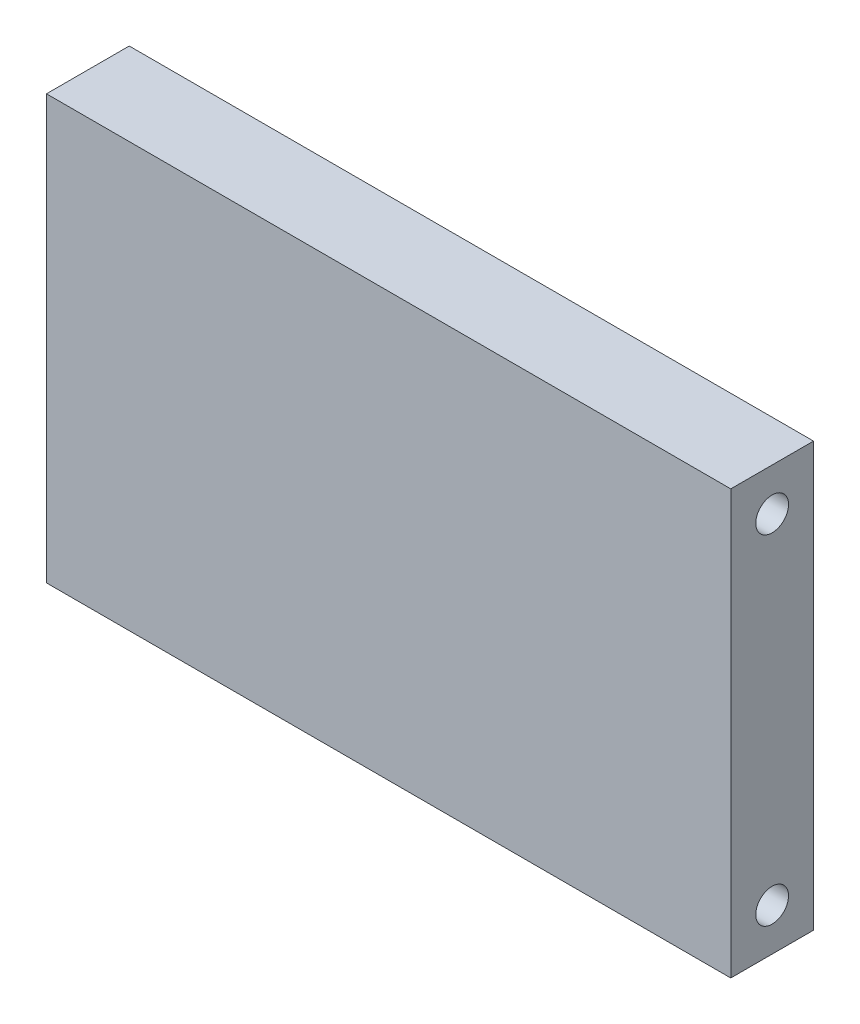
ISO-10303-21;
HEADER;
FILE_DESCRIPTION(('STEP AP214'),'2;1');
FILE_NAME('part.step','',(''),(''),'','','');
FILE_SCHEMA(('AUTOMOTIVE_DESIGN { 1 0 10303 214 1 1 1 1 }'));
ENDSEC;
DATA;
#1=APPLICATION_CONTEXT('core data for automotive mechanical design processes');
#2=APPLICATION_PROTOCOL_DEFINITION('international standard','automotive_design',2000,#1);
#3=PRODUCT_CONTEXT('',#1,'mechanical');
#4=PRODUCT('Part','Part','',(#3));
#5=PRODUCT_RELATED_PRODUCT_CATEGORY('part','',(#4));
#6=PRODUCT_DEFINITION_FORMATION('','',#4);
#7=PRODUCT_DEFINITION_CONTEXT('part definition',#1,'design');
#8=PRODUCT_DEFINITION('design','',#6,#7);
#9=PRODUCT_DEFINITION_SHAPE('','',#8);
#10=(LENGTH_UNIT() NAMED_UNIT(*) SI_UNIT(.MILLI.,.METRE.));
#11=(NAMED_UNIT(*) PLANE_ANGLE_UNIT() SI_UNIT($,.RADIAN.));
#12=(NAMED_UNIT(*) SI_UNIT($,.STERADIAN.) SOLID_ANGLE_UNIT());
#13=UNCERTAINTY_MEASURE_WITH_UNIT(LENGTH_MEASURE(1.E-05),#10,'distance_accuracy_value','');
#14=(GEOMETRIC_REPRESENTATION_CONTEXT(3) GLOBAL_UNCERTAINTY_ASSIGNED_CONTEXT((#13)) GLOBAL_UNIT_ASSIGNED_CONTEXT((#10,
#11,#12)) REPRESENTATION_CONTEXT('',''));
#15=CARTESIAN_POINT('',(0.,0.,0.));
#16=DIRECTION('',(0.,0.,1.));
#17=DIRECTION('',(1.,0.,0.));
#18=AXIS2_PLACEMENT_3D('',#15,#16,#17);
#19=CARTESIAN_POINT('',(-90.2093865777307,-9.44435697292469,0.));
#20=DIRECTION('',(0.,0.,1.));
#21=DIRECTION('',(1.,0.,0.));
#22=AXIS2_PLACEMENT_3D('',#19,#20,#21);
#23=PLANE('',#22);
#24=DIRECTION('',(0.,1.,0.));
#25=VECTOR('',#24,1.);
#26=CARTESIAN_POINT('',(-37.7093865777307,-41.9443569729247,0.));
#27=LINE('',#26,#25);
#28=CARTESIAN_POINT('',(-37.7093865777307,-41.9443569729247,0.));
#29=VERTEX_POINT('',#28);
#30=CARTESIAN_POINT('',(-37.7093865777307,23.0556430270753,0.));
#31=VERTEX_POINT('',#30);
#32=EDGE_CURVE('E27',#29,#31,#27,.T.);
#33=ORIENTED_EDGE('',*,*,#32,.F.);
#34=DIRECTION('',(1.,0.,0.));
#35=VECTOR('',#34,1.);
#36=CARTESIAN_POINT('',(-142.709386577731,-41.9443569729247,0.));
#37=LINE('',#36,#35);
#38=CARTESIAN_POINT('',(-142.709386577731,-41.9443569729247,0.));
#39=VERTEX_POINT('',#38);
#40=EDGE_CURVE('E137',#39,#29,#37,.T.);
#41=ORIENTED_EDGE('',*,*,#40,.F.);
#42=DIRECTION('',(0.,-1.,0.));
#43=VECTOR('',#42,1.);
#44=CARTESIAN_POINT('',(-142.709386577731,23.0556430270753,0.));
#45=LINE('',#44,#43);
#46=CARTESIAN_POINT('',(-142.709386577731,23.0556430270753,0.));
#47=VERTEX_POINT('',#46);
#48=EDGE_CURVE('E147',#47,#39,#45,.T.);
#49=ORIENTED_EDGE('',*,*,#48,.F.);
#50=DIRECTION('',(-1.,0.,0.));
#51=VECTOR('',#50,1.);
#52=CARTESIAN_POINT('',(-37.7093865777307,23.0556430270753,0.));
#53=LINE('',#52,#51);
#54=EDGE_CURVE('E142',#31,#47,#53,.T.);
#55=ORIENTED_EDGE('',*,*,#54,.F.);
#56=EDGE_LOOP('',(#33,#41,#49,#55));
#57=FACE_BOUND('',#56,.T.);
#58=ADVANCED_FACE('F16',(#57),#23,.F.);
#59=CARTESIAN_POINT('',(-90.2093865777307,-9.44435697292469,12.7));
#60=DIRECTION('',(0.,0.,1.));
#61=DIRECTION('',(1.,0.,0.));
#62=AXIS2_PLACEMENT_3D('',#59,#60,#61);
#63=PLANE('',#62);
#64=DIRECTION('',(0.,1.,0.));
#65=VECTOR('',#64,1.);
#66=CARTESIAN_POINT('',(-37.7093865777307,-41.9443569729247,12.7));
#67=LINE('',#66,#65);
#68=CARTESIAN_POINT('',(-37.7093865777307,-41.9443569729247,12.7));
#69=VERTEX_POINT('',#68);
#70=CARTESIAN_POINT('',(-37.7093865777307,23.0556430270753,12.7));
#71=VERTEX_POINT('',#70);
#72=EDGE_CURVE('E11',#69,#71,#67,.T.);
#73=ORIENTED_EDGE('',*,*,#72,.T.);
#74=DIRECTION('',(-1.,0.,0.));
#75=VECTOR('',#74,1.);
#76=CARTESIAN_POINT('',(-37.7093865777307,23.0556430270753,12.7));
#77=LINE('',#76,#75);
#78=CARTESIAN_POINT('',(-142.709386577731,23.0556430270753,12.7));
#79=VERTEX_POINT('',#78);
#80=EDGE_CURVE('E139',#71,#79,#77,.T.);
#81=ORIENTED_EDGE('',*,*,#80,.T.);
#82=DIRECTION('',(0.,-1.,0.));
#83=VECTOR('',#82,1.);
#84=CARTESIAN_POINT('',(-142.709386577731,23.0556430270753,12.7));
#85=LINE('',#84,#83);
#86=CARTESIAN_POINT('',(-142.709386577731,-41.9443569729247,12.7));
#87=VERTEX_POINT('',#86);
#88=EDGE_CURVE('E172',#79,#87,#85,.T.);
#89=ORIENTED_EDGE('',*,*,#88,.T.);
#90=DIRECTION('',(1.,0.,0.));
#91=VECTOR('',#90,1.);
#92=CARTESIAN_POINT('',(-142.709386577731,-41.9443569729247,12.7));
#93=LINE('',#92,#91);
#94=EDGE_CURVE('E148',#87,#69,#93,.T.);
#95=ORIENTED_EDGE('',*,*,#94,.T.);
#96=EDGE_LOOP('',(#73,#81,#89,#95));
#97=FACE_BOUND('',#96,.T.);
#98=ADVANCED_FACE('F183',(#97),#63,.T.);
#99=CARTESIAN_POINT('',(-37.7093865777307,-41.9443569729247,0.));
#100=DIRECTION('',(1.,0.,0.));
#101=DIRECTION('',(0.,1.,0.));
#102=AXIS2_PLACEMENT_3D('',#99,#100,#101);
#103=PLANE('',#102);
#104=CARTESIAN_POINT('',(-37.7093865777307,16.5556430270753,6.35));
#105=DIRECTION('',(-1.,0.,0.));
#106=DIRECTION('',(0.,1.,0.));
#107=AXIS2_PLACEMENT_3D('',#104,#105,#106);
#108=CIRCLE('',#107,2.51435);
#109=CARTESIAN_POINT('',(-37.7093865777307,14.0412930270753,6.35));
#110=VERTEX_POINT('',#109);
#111=EDGE_CURVE('E109',#110,#110,#108,.T.);
#112=ORIENTED_EDGE('',*,*,#111,.T.);
#113=EDGE_LOOP('',(#112));
#114=FACE_BOUND('',#113,.T.);
#115=CARTESIAN_POINT('',(-37.7093865777307,-35.4443569729247,6.35));
#116=DIRECTION('',(-1.,0.,0.));
#117=DIRECTION('',(0.,1.,0.));
#118=AXIS2_PLACEMENT_3D('',#115,#116,#117);
#119=CIRCLE('',#118,2.51435);
#120=CARTESIAN_POINT('',(-37.7093865777307,-37.9587069729247,6.35));
#121=VERTEX_POINT('',#120);
#122=EDGE_CURVE('E122',#121,#121,#119,.T.);
#123=ORIENTED_EDGE('',*,*,#122,.T.);
#124=EDGE_LOOP('',(#123));
#125=FACE_BOUND('',#124,.T.);
#126=ORIENTED_EDGE('',*,*,#32,.T.);
#127=DIRECTION('',(0.,0.,1.));
#128=VECTOR('',#127,1.);
#129=CARTESIAN_POINT('',(-37.7093865777307,23.0556430270753,0.));
#130=LINE('',#129,#128);
#131=EDGE_CURVE('E141',#31,#71,#130,.T.);
#132=ORIENTED_EDGE('',*,*,#131,.T.);
#133=ORIENTED_EDGE('',*,*,#72,.F.);
#134=DIRECTION('',(0.,0.,1.));
#135=VECTOR('',#134,1.);
#136=CARTESIAN_POINT('',(-37.7093865777307,-41.9443569729247,0.));
#137=LINE('',#136,#135);
#138=EDGE_CURVE('E120',#29,#69,#137,.T.);
#139=ORIENTED_EDGE('',*,*,#138,.F.);
#140=EDGE_LOOP('',(#126,#132,#133,#139));
#141=FACE_BOUND('',#140,.T.);
#142=ADVANCED_FACE('F155',(#114,#125,#141),#103,.T.);
#143=CARTESIAN_POINT('',(-37.7093865777307,23.0556430270753,0.));
#144=DIRECTION('',(0.,1.,0.));
#145=DIRECTION('',(1.,0.,0.));
#146=AXIS2_PLACEMENT_3D('',#143,#144,#145);
#147=PLANE('',#146);
#148=ORIENTED_EDGE('',*,*,#54,.T.);
#149=DIRECTION('',(0.,0.,1.));
#150=VECTOR('',#149,1.);
#151=CARTESIAN_POINT('',(-142.709386577731,23.0556430270753,0.));
#152=LINE('',#151,#150);
#153=EDGE_CURVE('E168',#47,#79,#152,.T.);
#154=ORIENTED_EDGE('',*,*,#153,.T.);
#155=ORIENTED_EDGE('',*,*,#80,.F.);
#156=ORIENTED_EDGE('',*,*,#131,.F.);
#157=EDGE_LOOP('',(#148,#154,#155,#156));
#158=FACE_BOUND('',#157,.T.);
#159=ADVANCED_FACE('F163',(#158),#147,.T.);
#160=CARTESIAN_POINT('',(-142.709386577731,23.0556430270753,0.));
#161=DIRECTION('',(-1.,0.,0.));
#162=DIRECTION('',(0.,0.,1.));
#163=AXIS2_PLACEMENT_3D('',#160,#161,#162);
#164=PLANE('',#163);
#165=ORIENTED_EDGE('',*,*,#48,.T.);
#166=DIRECTION('',(0.,0.,1.));
#167=VECTOR('',#166,1.);
#168=CARTESIAN_POINT('',(-142.709386577731,-41.9443569729247,0.));
#169=LINE('',#168,#167);
#170=EDGE_CURVE('E143',#39,#87,#169,.T.);
#171=ORIENTED_EDGE('',*,*,#170,.T.);
#172=ORIENTED_EDGE('',*,*,#88,.F.);
#173=ORIENTED_EDGE('',*,*,#153,.F.);
#174=EDGE_LOOP('',(#165,#171,#172,#173));
#175=FACE_BOUND('',#174,.T.);
#176=ADVANCED_FACE('F187',(#175),#164,.T.);
#177=CARTESIAN_POINT('',(-142.709386577731,-41.9443569729247,0.));
#178=DIRECTION('',(0.,-1.,0.));
#179=DIRECTION('',(0.,0.,-1.));
#180=AXIS2_PLACEMENT_3D('',#177,#178,#179);
#181=PLANE('',#180);
#182=ORIENTED_EDGE('',*,*,#40,.T.);
#183=ORIENTED_EDGE('',*,*,#138,.T.);
#184=ORIENTED_EDGE('',*,*,#94,.F.);
#185=ORIENTED_EDGE('',*,*,#170,.F.);
#186=EDGE_LOOP('',(#182,#183,#184,#185));
#187=FACE_BOUND('',#186,.T.);
#188=ADVANCED_FACE('F18',(#187),#181,.T.);
#189=CARTESIAN_POINT('',(-40.3833865777307,16.5556430270753,6.35));
#190=DIRECTION('',(-1.,0.,0.));
#191=DIRECTION('',(0.,1.,0.));
#192=AXIS2_PLACEMENT_3D('',#189,#190,#191);
#193=CYLINDRICAL_SURFACE('',#192,2.51435);
#194=ORIENTED_EDGE('',*,*,#111,.F.);
#195=DIRECTION('',(-1.,0.,0.));
#196=VECTOR('',#195,1.);
#197=CARTESIAN_POINT('',(-40.3833865777307,14.0412930270753,6.35));
#198=LINE('',#197,#196);
#199=CARTESIAN_POINT('',(-47.8833865777306,14.0412930270753,6.35));
#200=VERTEX_POINT('',#199);
#201=EDGE_CURVE('E20',#110,#200,#198,.T.);
#202=ORIENTED_EDGE('',*,*,#201,.T.);
#203=CARTESIAN_POINT('',(-47.8833865777306,16.5556430270753,6.35));
#204=DIRECTION('',(-1.,0.,0.));
#205=DIRECTION('',(0.,1.,0.));
#206=AXIS2_PLACEMENT_3D('',#203,#204,#205);
#207=CIRCLE('',#206,2.51435);
#208=EDGE_CURVE('E107',#200,#200,#207,.T.);
#209=ORIENTED_EDGE('',*,*,#208,.T.);
#210=ORIENTED_EDGE('',*,*,#201,.F.);
#211=EDGE_LOOP('',(#194,#202,#209,#210));
#212=FACE_BOUND('',#211,.T.);
#213=ADVANCED_FACE('F238',(#212),#193,.F.);
#214=CARTESIAN_POINT('',(-48.6387523699336,16.5556430270753,6.35));
#215=DIRECTION('',(1.,0.,0.));
#216=DIRECTION('',(0.,1.,0.));
#217=AXIS2_PLACEMENT_3D('',#214,#215,#216);
#218=CONICAL_SURFACE('',#217,1.25721021036721,1.02974425867665);
#219=ORIENTED_EDGE('',*,*,#208,.F.);
#220=DIRECTION('',(-0.515038074910054,0.857167300702112,0.));
#221=VECTOR('',#220,1.);
#222=CARTESIAN_POINT('',(-48.6387523699336,15.2984328167081,6.35));
#223=LINE('',#222,#221);
#224=CARTESIAN_POINT('',(-49.3941604751826,16.5556430270753,6.35));
#225=VERTEX_POINT('',#224);
#226=EDGE_CURVE('E105',#200,#225,#223,.T.);
#227=ORIENTED_EDGE('',*,*,#226,.T.);
#228=ORIENTED_EDGE('',*,*,#226,.F.);
#229=EDGE_LOOP('',(#219,#227,#228));
#230=FACE_BOUND('',#229,.T.);
#231=ADVANCED_FACE('F106',(#230),#218,.F.);
#232=CARTESIAN_POINT('',(-40.3833865777307,-35.4443569729247,6.35));
#233=DIRECTION('',(-1.,0.,0.));
#234=DIRECTION('',(0.,1.,0.));
#235=AXIS2_PLACEMENT_3D('',#232,#233,#234);
#236=CYLINDRICAL_SURFACE('',#235,2.51435);
#237=ORIENTED_EDGE('',*,*,#122,.F.);
#238=DIRECTION('',(-1.,0.,0.));
#239=VECTOR('',#238,1.);
#240=CARTESIAN_POINT('',(-40.3833865777307,-37.9587069729247,6.35));
#241=LINE('',#240,#239);
#242=CARTESIAN_POINT('',(-47.8833865777306,-37.9587069729247,6.35));
#243=VERTEX_POINT('',#242);
#244=EDGE_CURVE('E83',#121,#243,#241,.T.);
#245=ORIENTED_EDGE('',*,*,#244,.T.);
#246=CARTESIAN_POINT('',(-47.8833865777306,-35.4443569729247,6.35));
#247=DIRECTION('',(-1.,0.,0.));
#248=DIRECTION('',(0.,1.,0.));
#249=AXIS2_PLACEMENT_3D('',#246,#247,#248);
#250=CIRCLE('',#249,2.51435);
#251=EDGE_CURVE('E133',#243,#243,#250,.T.);
#252=ORIENTED_EDGE('',*,*,#251,.T.);
#253=ORIENTED_EDGE('',*,*,#244,.F.);
#254=EDGE_LOOP('',(#237,#245,#252,#253));
#255=FACE_BOUND('',#254,.T.);
#256=ADVANCED_FACE('F200',(#255),#236,.F.);
#257=CARTESIAN_POINT('',(-48.6387523699336,-35.4443569729247,6.35));
#258=DIRECTION('',(1.,0.,0.));
#259=DIRECTION('',(0.,1.,0.));
#260=AXIS2_PLACEMENT_3D('',#257,#258,#259);
#261=CONICAL_SURFACE('',#260,1.25721021036721,1.02974425867665);
#262=ORIENTED_EDGE('',*,*,#251,.F.);
#263=DIRECTION('',(-0.515038074910054,0.857167300702112,0.));
#264=VECTOR('',#263,1.);
#265=CARTESIAN_POINT('',(-48.6387523699336,-36.7015671832919,6.35));
#266=LINE('',#265,#264);
#267=CARTESIAN_POINT('',(-49.3941604751826,-35.4443569729247,6.35));
#268=VERTEX_POINT('',#267);
#269=EDGE_CURVE('E93',#243,#268,#266,.T.);
#270=ORIENTED_EDGE('',*,*,#269,.T.);
#271=ORIENTED_EDGE('',*,*,#269,.F.);
#272=EDGE_LOOP('',(#262,#270,#271));
#273=FACE_BOUND('',#272,.T.);
#274=ADVANCED_FACE('F195',(#273),#261,.F.);
#275=CLOSED_SHELL('',(#58,#98,#142,#159,#176,#188,#213,#231,#256,#274));
#276=MANIFOLD_SOLID_BREP('B1',#275);
#277=ADVANCED_BREP_SHAPE_REPRESENTATION('',(#18,#276),#14);
#278=SHAPE_DEFINITION_REPRESENTATION(#9,#277);
ENDSEC;
END-ISO-10303-21;
